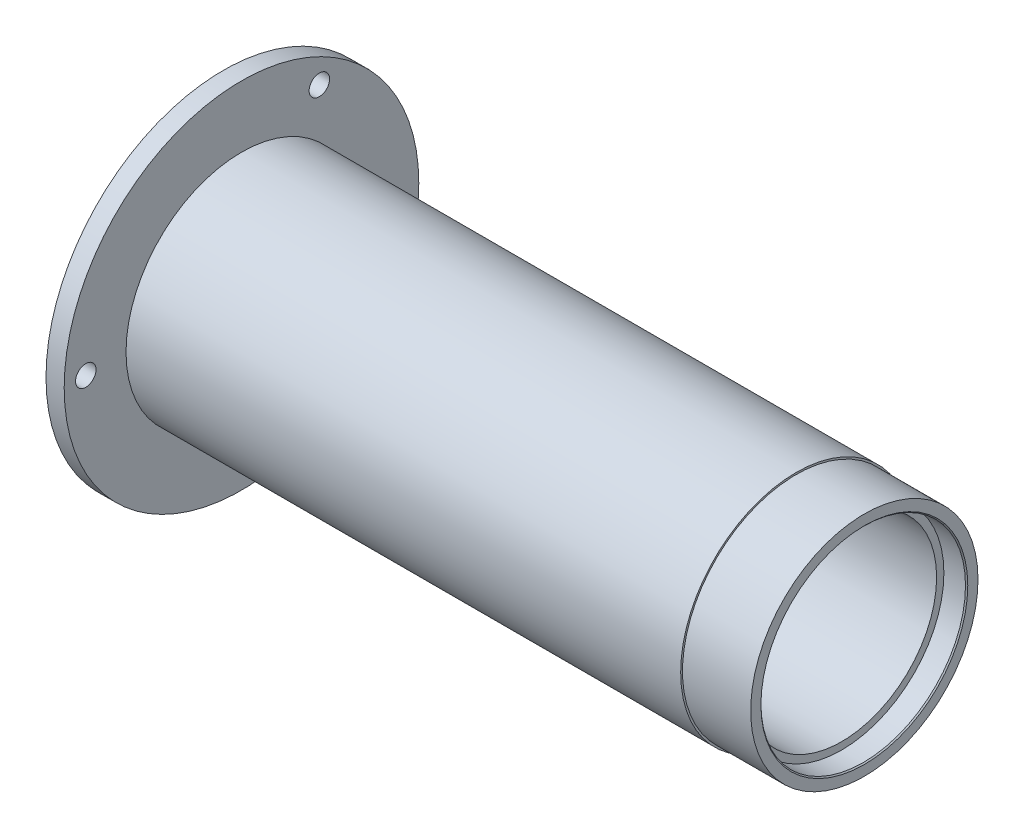
ISO-10303-21;
HEADER;
FILE_DESCRIPTION(('STEP AP214'),'2;1');
FILE_NAME('part.step','',(''),(''),'','','');
FILE_SCHEMA(('AUTOMOTIVE_DESIGN { 1 0 10303 214 1 1 1 1 }'));
ENDSEC;
DATA;
#1=APPLICATION_CONTEXT('core data for automotive mechanical design processes');
#2=APPLICATION_PROTOCOL_DEFINITION('international standard','automotive_design',2000,#1);
#3=PRODUCT_CONTEXT('',#1,'mechanical');
#4=PRODUCT('Part','Part','',(#3));
#5=PRODUCT_RELATED_PRODUCT_CATEGORY('part','',(#4));
#6=PRODUCT_DEFINITION_FORMATION('','',#4);
#7=PRODUCT_DEFINITION_CONTEXT('part definition',#1,'design');
#8=PRODUCT_DEFINITION('design','',#6,#7);
#9=PRODUCT_DEFINITION_SHAPE('','',#8);
#10=(LENGTH_UNIT() NAMED_UNIT(*) SI_UNIT(.MILLI.,.METRE.));
#11=(NAMED_UNIT(*) PLANE_ANGLE_UNIT() SI_UNIT($,.RADIAN.));
#12=(NAMED_UNIT(*) SI_UNIT($,.STERADIAN.) SOLID_ANGLE_UNIT());
#13=UNCERTAINTY_MEASURE_WITH_UNIT(LENGTH_MEASURE(1.E-05),#10,'distance_accuracy_value','');
#14=(GEOMETRIC_REPRESENTATION_CONTEXT(3) GLOBAL_UNCERTAINTY_ASSIGNED_CONTEXT((#13)) GLOBAL_UNIT_ASSIGNED_CONTEXT((#10,
#11,#12)) REPRESENTATION_CONTEXT('',''));
#15=CARTESIAN_POINT('',(0.,0.,0.));
#16=DIRECTION('',(0.,0.,1.));
#17=DIRECTION('',(1.,0.,0.));
#18=AXIS2_PLACEMENT_3D('',#15,#16,#17);
#19=CARTESIAN_POINT('',(-1.2E-05,0.,0.));
#20=DIRECTION('',(1.,0.,0.));
#21=DIRECTION('',(0.,0.,-1.));
#22=AXIS2_PLACEMENT_3D('',#19,#20,#21);
#23=CYLINDRICAL_SURFACE('',#22,41.8);
#24=CARTESIAN_POINT('',(10.,0.,0.));
#25=DIRECTION('',(1.,0.,0.));
#26=DIRECTION('',(0.,0.,-1.));
#27=AXIS2_PLACEMENT_3D('',#24,#25,#26);
#28=CIRCLE('',#27,41.8);
#29=CARTESIAN_POINT('',(10.,0.,-41.8));
#30=VERTEX_POINT('',#29);
#31=EDGE_CURVE('E76',#30,#30,#28,.F.);
#32=CARTESIAN_POINT('',(272.,0.,0.));
#33=DIRECTION('',(1.,0.,0.));
#34=DIRECTION('',(0.,0.,-1.));
#35=AXIS2_PLACEMENT_3D('',#32,#33,#34);
#36=CIRCLE('',#35,41.8);
#37=CARTESIAN_POINT('',(272.,0.,-41.8));
#38=VERTEX_POINT('',#37);
#39=EDGE_CURVE('E71',#38,#38,#36,.F.);
#40=CARTESIAN_POINT('',(10.,0.,-41.8));
#41=CARTESIAN_POINT('',(12.7291666666667,0.,-41.8));
#42=CARTESIAN_POINT('',(15.4583333333333,0.,-41.8));
#43=CARTESIAN_POINT('',(20.9166666666667,0.,-41.8));
#44=CARTESIAN_POINT('',(23.6458333333333,0.,-41.8));
#45=CARTESIAN_POINT('',(29.1041666666667,0.,-41.8));
#46=CARTESIAN_POINT('',(31.8333333333333,0.,-41.8));
#47=CARTESIAN_POINT('',(37.2916666666667,0.,-41.8));
#48=CARTESIAN_POINT('',(40.0208333333333,0.,-41.8));
#49=CARTESIAN_POINT('',(45.4791666666667,0.,-41.8));
#50=CARTESIAN_POINT('',(48.2083333333333,0.,-41.8));
#51=CARTESIAN_POINT('',(53.6666666666667,0.,-41.8));
#52=CARTESIAN_POINT('',(56.3958333333333,0.,-41.8));
#53=CARTESIAN_POINT('',(61.8541666666667,0.,-41.8));
#54=CARTESIAN_POINT('',(64.5833333333333,0.,-41.8));
#55=CARTESIAN_POINT('',(70.0416666666667,0.,-41.8));
#56=CARTESIAN_POINT('',(72.7708333333333,0.,-41.8));
#57=CARTESIAN_POINT('',(78.2291666666667,0.,-41.8));
#58=CARTESIAN_POINT('',(80.9583333333333,0.,-41.8));
#59=CARTESIAN_POINT('',(86.4166666666667,0.,-41.8));
#60=CARTESIAN_POINT('',(89.1458333333333,0.,-41.8));
#61=CARTESIAN_POINT('',(94.6041666666667,0.,-41.8));
#62=CARTESIAN_POINT('',(97.3333333333333,0.,-41.8));
#63=CARTESIAN_POINT('',(102.791666666667,0.,-41.8));
#64=CARTESIAN_POINT('',(105.520833333333,0.,-41.8));
#65=CARTESIAN_POINT('',(110.979166666667,0.,-41.8));
#66=CARTESIAN_POINT('',(113.708333333333,0.,-41.8));
#67=CARTESIAN_POINT('',(119.166666666667,0.,-41.8));
#68=CARTESIAN_POINT('',(121.895833333333,0.,-41.8));
#69=CARTESIAN_POINT('',(127.354166666667,0.,-41.8));
#70=CARTESIAN_POINT('',(130.083333333333,0.,-41.8));
#71=CARTESIAN_POINT('',(135.541666666667,0.,-41.8));
#72=CARTESIAN_POINT('',(138.270833333333,0.,-41.8));
#73=CARTESIAN_POINT('',(143.729166666667,0.,-41.8));
#74=CARTESIAN_POINT('',(146.458333333333,0.,-41.8));
#75=CARTESIAN_POINT('',(151.916666666667,0.,-41.8));
#76=CARTESIAN_POINT('',(154.645833333333,0.,-41.8));
#77=CARTESIAN_POINT('',(160.104166666667,0.,-41.8));
#78=CARTESIAN_POINT('',(162.833333333333,0.,-41.8));
#79=CARTESIAN_POINT('',(168.291666666667,0.,-41.8));
#80=CARTESIAN_POINT('',(171.020833333333,0.,-41.8));
#81=CARTESIAN_POINT('',(176.479166666667,0.,-41.8));
#82=CARTESIAN_POINT('',(179.208333333333,0.,-41.8));
#83=CARTESIAN_POINT('',(184.666666666667,0.,-41.8));
#84=CARTESIAN_POINT('',(187.395833333333,0.,-41.8));
#85=CARTESIAN_POINT('',(192.854166666667,0.,-41.8));
#86=CARTESIAN_POINT('',(195.583333333333,0.,-41.8));
#87=CARTESIAN_POINT('',(201.041666666667,0.,-41.8));
#88=CARTESIAN_POINT('',(203.770833333333,0.,-41.8));
#89=CARTESIAN_POINT('',(209.229166666667,0.,-41.8));
#90=CARTESIAN_POINT('',(211.958333333333,0.,-41.8));
#91=CARTESIAN_POINT('',(217.416666666667,0.,-41.8));
#92=CARTESIAN_POINT('',(220.145833333333,0.,-41.8));
#93=CARTESIAN_POINT('',(225.604166666667,0.,-41.8));
#94=CARTESIAN_POINT('',(228.333333333333,0.,-41.8));
#95=CARTESIAN_POINT('',(233.791666666667,0.,-41.8));
#96=CARTESIAN_POINT('',(236.520833333333,0.,-41.8));
#97=CARTESIAN_POINT('',(241.979166666667,0.,-41.8));
#98=CARTESIAN_POINT('',(244.708333333333,0.,-41.8));
#99=CARTESIAN_POINT('',(250.166666666667,0.,-41.8));
#100=CARTESIAN_POINT('',(252.895833333333,0.,-41.8));
#101=CARTESIAN_POINT('',(258.354166666667,0.,-41.8));
#102=CARTESIAN_POINT('',(261.083333333333,0.,-41.8));
#103=CARTESIAN_POINT('',(266.541666666667,0.,-41.8));
#104=CARTESIAN_POINT('',(269.270833333333,0.,-41.8));
#105=CARTESIAN_POINT('',(272.,0.,-41.8));
#106=B_SPLINE_CURVE_WITH_KNOTS('',3,(#40,#41,#42,#43,#44,#45,#46,#47,#48,#49,#50,#51,#52,#53,
#54,#55,#56,#57,#58,#59,#60,#61,#62,#63,#64,#65,#66,#67,#68,#69,#70,#71,#72,#73,#74,#75,#76,#77,
#78,#79,#80,#81,#82,#83,#84,#85,#86,#87,#88,#89,#90,#91,#92,#93,#94,#95,#96,#97,#98,#99,#100,
#101,#102,#103,#104,#105),.UNSPECIFIED.,.F.,.F.,(4,2,2,2,2,2,2,2,2,2,2,2,2,2,2,2,2,2,2,2,2,2,2,
2,2,2,2,2,2,2,2,2,4),(0.,8.1875,16.375,24.5625,32.75,40.9375,49.125,57.3125,65.5,73.6875,81.875,
90.0625,98.25,106.4375,114.625,122.8125,131.,139.1875,147.375,155.5625,163.75,171.9375,180.125,
188.3125,196.5,204.6875,212.875,221.0625,229.25,237.4375,245.625,253.8125,262.),.UNSPECIFIED.);
#107=EDGE_CURVE('BSEAM37',#30,#38,#106,.T.);
#108=ORIENTED_EDGE('',*,*,#31,.T.);
#109=ORIENTED_EDGE('',*,*,#39,.F.);
#110=ORIENTED_EDGE('',*,*,#107,.T.);
#111=ORIENTED_EDGE('',*,*,#107,.F.);
#112=EDGE_LOOP('',(#108,#110,#109,#111));
#113=FACE_BOUND('',#112,.T.);
#114=ADVANCED_FACE('F37',(#113),#23,.F.);
#115=CARTESIAN_POINT('',(8.,0.,0.));
#116=DIRECTION('',(-1.,0.,0.));
#117=DIRECTION('',(0.,0.,1.));
#118=AXIS2_PLACEMENT_3D('',#115,#116,#117);
#119=CYLINDRICAL_SURFACE('',#118,78.);
#120=CARTESIAN_POINT('',(8.,0.,0.));
#121=DIRECTION('',(1.,0.,0.));
#122=DIRECTION('',(0.,0.,-1.));
#123=AXIS2_PLACEMENT_3D('',#120,#121,#122);
#124=CIRCLE('',#123,78.);
#125=CARTESIAN_POINT('',(8.,0.,-78.));
#126=VERTEX_POINT('',#125);
#127=EDGE_CURVE('E58',#126,#126,#124,.T.);
#128=ORIENTED_EDGE('',*,*,#127,.F.);
#129=EDGE_LOOP('',(#128));
#130=FACE_BOUND('',#129,.T.);
#131=CARTESIAN_POINT('',(0.,0.,0.));
#132=DIRECTION('',(1.,0.,0.));
#133=DIRECTION('',(0.,0.,-1.));
#134=AXIS2_PLACEMENT_3D('',#131,#132,#133);
#135=CIRCLE('',#134,78.);
#136=CARTESIAN_POINT('',(0.,0.,-78.));
#137=VERTEX_POINT('',#136);
#138=EDGE_CURVE('E84',#137,#137,#135,.T.);
#139=ORIENTED_EDGE('',*,*,#138,.T.);
#140=EDGE_LOOP('',(#139));
#141=FACE_BOUND('',#140,.T.);
#142=ADVANCED_FACE('F114',(#130,#141),#119,.T.);
#143=CARTESIAN_POINT('',(8.,0.,0.));
#144=DIRECTION('',(1.,0.,0.));
#145=DIRECTION('',(0.,0.,-1.));
#146=AXIS2_PLACEMENT_3D('',#143,#144,#145);
#147=PLANE('',#146);
#148=CARTESIAN_POINT('',(8.,0.,68.5));
#149=DIRECTION('',(1.,0.,0.));
#150=DIRECTION('',(0.,0.,-1.));
#151=AXIS2_PLACEMENT_3D('',#148,#149,#150);
#152=CIRCLE('',#151,4.5);
#153=CARTESIAN_POINT('',(8.,0.,64.));
#154=VERTEX_POINT('',#153);
#155=EDGE_CURVE('E62',#154,#154,#152,.T.);
#156=ORIENTED_EDGE('',*,*,#155,.F.);
#157=EDGE_LOOP('',(#156));
#158=FACE_BOUND('',#157,.T.);
#159=CARTESIAN_POINT('',(8.,59.3227401592341,-34.25));
#160=DIRECTION('',(1.,0.,0.));
#161=DIRECTION('',(0.,0.,-1.));
#162=AXIS2_PLACEMENT_3D('',#159,#160,#161);
#163=CIRCLE('',#162,4.5);
#164=CARTESIAN_POINT('',(8.,59.3227401592341,-38.75));
#165=VERTEX_POINT('',#164);
#166=EDGE_CURVE('E63',#165,#165,#163,.T.);
#167=ORIENTED_EDGE('',*,*,#166,.F.);
#168=EDGE_LOOP('',(#167));
#169=FACE_BOUND('',#168,.T.);
#170=CARTESIAN_POINT('',(8.,-59.3227401592341,-34.25));
#171=DIRECTION('',(1.,0.,0.));
#172=DIRECTION('',(0.,0.,-1.));
#173=AXIS2_PLACEMENT_3D('',#170,#171,#172);
#174=CIRCLE('',#173,4.5);
#175=CARTESIAN_POINT('',(8.,-59.3227401592341,-38.75));
#176=VERTEX_POINT('',#175);
#177=EDGE_CURVE('E67',#176,#176,#174,.T.);
#178=ORIENTED_EDGE('',*,*,#177,.F.);
#179=EDGE_LOOP('',(#178));
#180=FACE_BOUND('',#179,.T.);
#181=CARTESIAN_POINT('',(8.00000000000001,0.,0.));
#182=DIRECTION('',(1.,0.,0.));
#183=DIRECTION('',(0.,0.,-1.));
#184=AXIS2_PLACEMENT_3D('',#181,#182,#183);
#185=CIRCLE('',#184,50.8);
#186=CARTESIAN_POINT('',(8.00000000000001,0.,-50.8));
#187=VERTEX_POINT('',#186);
#188=EDGE_CURVE('E87',#187,#187,#185,.F.);
#189=ORIENTED_EDGE('',*,*,#188,.T.);
#190=EDGE_LOOP('',(#189));
#191=FACE_BOUND('',#190,.T.);
#192=ORIENTED_EDGE('',*,*,#127,.T.);
#193=EDGE_LOOP('',(#192));
#194=FACE_BOUND('',#193,.T.);
#195=ADVANCED_FACE('F110',(#158,#169,#180,#191,#194),#147,.T.);
#196=CARTESIAN_POINT('',(0.,0.,0.));
#197=DIRECTION('',(1.,0.,0.));
#198=DIRECTION('',(0.,0.,-1.));
#199=AXIS2_PLACEMENT_3D('',#196,#197,#198);
#200=PLANE('',#199);
#201=CARTESIAN_POINT('',(0.,0.,0.));
#202=DIRECTION('',(1.,0.,0.));
#203=DIRECTION('',(0.,0.,-1.));
#204=AXIS2_PLACEMENT_3D('',#201,#202,#203);
#205=CIRCLE('',#204,45.4999999999999);
#206=CARTESIAN_POINT('',(0.,0.,-45.4999999999999));
#207=VERTEX_POINT('',#206);
#208=EDGE_CURVE('E53',#207,#207,#205,.T.);
#209=ORIENTED_EDGE('',*,*,#208,.T.);
#210=EDGE_LOOP('',(#209));
#211=FACE_BOUND('',#210,.T.);
#212=CARTESIAN_POINT('',(0.,0.,68.5));
#213=DIRECTION('',(1.,0.,0.));
#214=DIRECTION('',(0.,0.,-1.));
#215=AXIS2_PLACEMENT_3D('',#212,#213,#214);
#216=CIRCLE('',#215,4.5);
#217=CARTESIAN_POINT('',(0.,0.,64.));
#218=VERTEX_POINT('',#217);
#219=EDGE_CURVE('E59',#218,#218,#216,.T.);
#220=ORIENTED_EDGE('',*,*,#219,.T.);
#221=EDGE_LOOP('',(#220));
#222=FACE_BOUND('',#221,.T.);
#223=CARTESIAN_POINT('',(0.,59.3227401592341,-34.25));
#224=DIRECTION('',(1.,0.,0.));
#225=DIRECTION('',(0.,0.,-1.));
#226=AXIS2_PLACEMENT_3D('',#223,#224,#225);
#227=CIRCLE('',#226,4.5);
#228=CARTESIAN_POINT('',(0.,59.3227401592341,-38.75));
#229=VERTEX_POINT('',#228);
#230=EDGE_CURVE('E64',#229,#229,#227,.T.);
#231=ORIENTED_EDGE('',*,*,#230,.T.);
#232=EDGE_LOOP('',(#231));
#233=FACE_BOUND('',#232,.T.);
#234=CARTESIAN_POINT('',(0.,-59.3227401592341,-34.25));
#235=DIRECTION('',(1.,0.,0.));
#236=DIRECTION('',(0.,0.,-1.));
#237=AXIS2_PLACEMENT_3D('',#234,#235,#236);
#238=CIRCLE('',#237,4.5);
#239=CARTESIAN_POINT('',(0.,-59.3227401592341,-38.75));
#240=VERTEX_POINT('',#239);
#241=EDGE_CURVE('E68',#240,#240,#238,.T.);
#242=ORIENTED_EDGE('',*,*,#241,.T.);
#243=EDGE_LOOP('',(#242));
#244=FACE_BOUND('',#243,.T.);
#245=ORIENTED_EDGE('',*,*,#138,.F.);
#246=EDGE_LOOP('',(#245));
#247=FACE_BOUND('',#246,.T.);
#248=ADVANCED_FACE('F113',(#211,#222,#233,#244,#247),#200,.F.);
#249=CARTESIAN_POINT('',(252.,0.,0.));
#250=DIRECTION('',(-1.,0.,0.));
#251=DIRECTION('',(0.,0.,1.));
#252=AXIS2_PLACEMENT_3D('',#249,#250,#251);
#253=CYLINDRICAL_SURFACE('',#252,50.8);
#254=ORIENTED_EDGE('',*,*,#188,.F.);
#255=EDGE_LOOP('',(#254));
#256=FACE_BOUND('',#255,.T.);
#257=CARTESIAN_POINT('',(252.,0.,0.));
#258=DIRECTION('',(1.,0.,0.));
#259=DIRECTION('',(0.,0.,-1.));
#260=AXIS2_PLACEMENT_3D('',#257,#258,#259);
#261=CIRCLE('',#260,50.8);
#262=CARTESIAN_POINT('',(252.,0.,-50.8));
#263=VERTEX_POINT('',#262);
#264=EDGE_CURVE('E83',#263,#263,#261,.T.);
#265=ORIENTED_EDGE('',*,*,#264,.F.);
#266=EDGE_LOOP('',(#265));
#267=FACE_BOUND('',#266,.T.);
#268=ADVANCED_FACE('F127',(#256,#267),#253,.T.);
#269=CARTESIAN_POINT('',(252.,0.,0.));
#270=DIRECTION('',(1.,0.,0.));
#271=DIRECTION('',(0.,0.,-1.));
#272=AXIS2_PLACEMENT_3D('',#269,#270,#271);
#273=PLANE('',#272);
#274=CARTESIAN_POINT('',(252.,0.,0.));
#275=DIRECTION('',(1.,0.,0.));
#276=DIRECTION('',(0.,0.,-1.));
#277=AXIS2_PLACEMENT_3D('',#274,#275,#276);
#278=CIRCLE('',#277,50.);
#279=CARTESIAN_POINT('',(252.,0.,-50.));
#280=VERTEX_POINT('',#279);
#281=EDGE_CURVE('E80',#280,#280,#278,.F.);
#282=ORIENTED_EDGE('',*,*,#281,.T.);
#283=EDGE_LOOP('',(#282));
#284=FACE_BOUND('',#283,.T.);
#285=ORIENTED_EDGE('',*,*,#264,.T.);
#286=EDGE_LOOP('',(#285));
#287=FACE_BOUND('',#286,.T.);
#288=ADVANCED_FACE('F133',(#284,#287),#273,.T.);
#289=CARTESIAN_POINT('',(282.,0.,0.));
#290=DIRECTION('',(-1.,0.,0.));
#291=DIRECTION('',(0.,0.,1.));
#292=AXIS2_PLACEMENT_3D('',#289,#290,#291);
#293=CYLINDRICAL_SURFACE('',#292,50.);
#294=ORIENTED_EDGE('',*,*,#281,.F.);
#295=EDGE_LOOP('',(#294));
#296=FACE_BOUND('',#295,.T.);
#297=CARTESIAN_POINT('',(282.,0.,0.));
#298=DIRECTION('',(1.,0.,0.));
#299=DIRECTION('',(0.,0.,-1.));
#300=AXIS2_PLACEMENT_3D('',#297,#298,#299);
#301=CIRCLE('',#300,50.);
#302=CARTESIAN_POINT('',(282.,0.,-50.));
#303=VERTEX_POINT('',#302);
#304=EDGE_CURVE('E79',#303,#303,#301,.T.);
#305=ORIENTED_EDGE('',*,*,#304,.F.);
#306=EDGE_LOOP('',(#305));
#307=FACE_BOUND('',#306,.T.);
#308=ADVANCED_FACE('F151',(#296,#307),#293,.T.);
#309=CARTESIAN_POINT('',(282.,0.,0.));
#310=DIRECTION('',(1.,0.,0.));
#311=DIRECTION('',(0.,0.,-1.));
#312=AXIS2_PLACEMENT_3D('',#309,#310,#311);
#313=PLANE('',#312);
#314=CARTESIAN_POINT('',(282.,0.,0.));
#315=DIRECTION('',(1.,0.,0.));
#316=DIRECTION('',(0.,0.,-1.));
#317=AXIS2_PLACEMENT_3D('',#314,#315,#316);
#318=CIRCLE('',#317,45.4999999999999);
#319=CARTESIAN_POINT('',(282.,0.,-45.4999999999999));
#320=VERTEX_POINT('',#319);
#321=EDGE_CURVE('E10',#320,#320,#318,.F.);
#322=ORIENTED_EDGE('',*,*,#321,.T.);
#323=EDGE_LOOP('',(#322));
#324=FACE_BOUND('',#323,.T.);
#325=ORIENTED_EDGE('',*,*,#304,.T.);
#326=EDGE_LOOP('',(#325));
#327=FACE_BOUND('',#326,.T.);
#328=ADVANCED_FACE('F147',(#324,#327),#313,.T.);
#329=CARTESIAN_POINT('',(10.,0.,0.));
#330=DIRECTION('',(1.,0.,0.));
#331=DIRECTION('',(0.,0.,-1.));
#332=AXIS2_PLACEMENT_3D('',#329,#330,#331);
#333=PLANE('',#332);
#334=CARTESIAN_POINT('',(10.,0.,0.));
#335=DIRECTION('',(1.,0.,0.));
#336=DIRECTION('',(0.,0.,-1.));
#337=AXIS2_PLACEMENT_3D('',#334,#335,#336);
#338=CIRCLE('',#337,45.);
#339=CARTESIAN_POINT('',(10.,0.,-45.));
#340=VERTEX_POINT('',#339);
#341=EDGE_CURVE('E74',#340,#340,#338,.T.);
#342=ORIENTED_EDGE('',*,*,#341,.F.);
#343=EDGE_LOOP('',(#342));
#344=FACE_BOUND('',#343,.T.);
#345=ORIENTED_EDGE('',*,*,#31,.F.);
#346=EDGE_LOOP('',(#345));
#347=FACE_BOUND('',#346,.T.);
#348=ADVANCED_FACE('F150',(#344,#347),#333,.F.);
#349=CARTESIAN_POINT('',(10.,0.,0.));
#350=DIRECTION('',(-1.,0.,0.));
#351=DIRECTION('',(0.,0.,1.));
#352=AXIS2_PLACEMENT_3D('',#349,#350,#351);
#353=CYLINDRICAL_SURFACE('',#352,45.);
#354=CARTESIAN_POINT('',(0.499999999999931,0.,0.));
#355=DIRECTION('',(1.,0.,0.));
#356=DIRECTION('',(0.,0.,-1.));
#357=AXIS2_PLACEMENT_3D('',#354,#355,#356);
#358=CIRCLE('',#357,45.);
#359=CARTESIAN_POINT('',(0.499999999999931,0.,-45.));
#360=VERTEX_POINT('',#359);
#361=EDGE_CURVE('E49',#360,#360,#358,.F.);
#362=ORIENTED_EDGE('',*,*,#361,.T.);
#363=EDGE_LOOP('',(#362));
#364=FACE_BOUND('',#363,.T.);
#365=ORIENTED_EDGE('',*,*,#341,.T.);
#366=EDGE_LOOP('',(#365));
#367=FACE_BOUND('',#366,.T.);
#368=ADVANCED_FACE('F145',(#364,#367),#353,.F.);
#369=CARTESIAN_POINT('',(272.,0.,0.));
#370=DIRECTION('',(1.,0.,0.));
#371=DIRECTION('',(0.,0.,-1.));
#372=AXIS2_PLACEMENT_3D('',#369,#370,#371);
#373=PLANE('',#372);
#374=CARTESIAN_POINT('',(272.,0.,0.));
#375=DIRECTION('',(1.,0.,0.));
#376=DIRECTION('',(0.,0.,-1.));
#377=AXIS2_PLACEMENT_3D('',#374,#375,#376);
#378=CIRCLE('',#377,45.);
#379=CARTESIAN_POINT('',(272.,0.,-45.));
#380=VERTEX_POINT('',#379);
#381=EDGE_CURVE('E75',#380,#380,#378,.T.);
#382=ORIENTED_EDGE('',*,*,#381,.T.);
#383=EDGE_LOOP('',(#382));
#384=FACE_BOUND('',#383,.T.);
#385=ORIENTED_EDGE('',*,*,#39,.T.);
#386=EDGE_LOOP('',(#385));
#387=FACE_BOUND('',#386,.T.);
#388=ADVANCED_FACE('F190',(#384,#387),#373,.T.);
#389=CARTESIAN_POINT('',(272.,0.,0.));
#390=DIRECTION('',(1.,0.,0.));
#391=DIRECTION('',(0.,0.,-1.));
#392=AXIS2_PLACEMENT_3D('',#389,#390,#391);
#393=CYLINDRICAL_SURFACE('',#392,45.);
#394=CARTESIAN_POINT('',(281.5,0.,0.));
#395=DIRECTION('',(1.,0.,0.));
#396=DIRECTION('',(0.,0.,-1.));
#397=AXIS2_PLACEMENT_3D('',#394,#395,#396);
#398=CIRCLE('',#397,45.);
#399=CARTESIAN_POINT('',(281.5,0.,-45.));
#400=VERTEX_POINT('',#399);
#401=EDGE_CURVE('E45',#400,#400,#398,.T.);
#402=ORIENTED_EDGE('',*,*,#401,.T.);
#403=EDGE_LOOP('',(#402));
#404=FACE_BOUND('',#403,.T.);
#405=ORIENTED_EDGE('',*,*,#381,.F.);
#406=EDGE_LOOP('',(#405));
#407=FACE_BOUND('',#406,.T.);
#408=ADVANCED_FACE('F197',(#404,#407),#393,.F.);
#409=CARTESIAN_POINT('',(-1.2E-05,-59.3227401592341,-34.25));
#410=DIRECTION('',(1.,0.,0.));
#411=DIRECTION('',(0.,0.,-1.));
#412=AXIS2_PLACEMENT_3D('',#409,#410,#411);
#413=CYLINDRICAL_SURFACE('',#412,4.5);
#414=CARTESIAN_POINT('',(8.,-59.3227401592341,-38.75));
#415=CARTESIAN_POINT('',(7.91666666666667,-59.3227401592341,-38.75));
#416=CARTESIAN_POINT('',(7.83333333333333,-59.3227401592341,-38.75));
#417=CARTESIAN_POINT('',(7.66666666666667,-59.3227401592341,-38.75));
#418=CARTESIAN_POINT('',(7.58333333333333,-59.3227401592341,-38.75));
#419=CARTESIAN_POINT('',(7.41666666666667,-59.3227401592341,-38.75));
#420=CARTESIAN_POINT('',(7.33333333333333,-59.3227401592341,-38.75));
#421=CARTESIAN_POINT('',(7.16666666666667,-59.3227401592341,-38.75));
#422=CARTESIAN_POINT('',(7.08333333333333,-59.3227401592341,-38.75));
#423=CARTESIAN_POINT('',(6.91666666666667,-59.3227401592341,-38.75));
#424=CARTESIAN_POINT('',(6.83333333333333,-59.3227401592341,-38.75));
#425=CARTESIAN_POINT('',(6.66666666666667,-59.3227401592341,-38.75));
#426=CARTESIAN_POINT('',(6.58333333333333,-59.3227401592341,-38.75));
#427=CARTESIAN_POINT('',(6.41666666666667,-59.3227401592341,-38.75));
#428=CARTESIAN_POINT('',(6.33333333333333,-59.3227401592341,-38.75));
#429=CARTESIAN_POINT('',(6.16666666666667,-59.3227401592341,-38.75));
#430=CARTESIAN_POINT('',(6.08333333333333,-59.3227401592341,-38.75));
#431=CARTESIAN_POINT('',(5.91666666666667,-59.3227401592341,-38.75));
#432=CARTESIAN_POINT('',(5.83333333333333,-59.3227401592341,-38.75));
#433=CARTESIAN_POINT('',(5.66666666666667,-59.3227401592341,-38.75));
#434=CARTESIAN_POINT('',(5.58333333333333,-59.3227401592341,-38.75));
#435=CARTESIAN_POINT('',(5.41666666666667,-59.3227401592341,-38.75));
#436=CARTESIAN_POINT('',(5.33333333333333,-59.3227401592341,-38.75));
#437=CARTESIAN_POINT('',(5.16666666666667,-59.3227401592341,-38.75));
#438=CARTESIAN_POINT('',(5.08333333333333,-59.3227401592341,-38.75));
#439=CARTESIAN_POINT('',(4.91666666666667,-59.3227401592341,-38.75));
#440=CARTESIAN_POINT('',(4.83333333333333,-59.3227401592341,-38.75));
#441=CARTESIAN_POINT('',(4.66666666666667,-59.3227401592341,-38.75));
#442=CARTESIAN_POINT('',(4.58333333333333,-59.3227401592341,-38.75));
#443=CARTESIAN_POINT('',(4.41666666666667,-59.3227401592341,-38.75));
#444=CARTESIAN_POINT('',(4.33333333333333,-59.3227401592341,-38.75));
#445=CARTESIAN_POINT('',(4.16666666666667,-59.3227401592341,-38.75));
#446=CARTESIAN_POINT('',(4.08333333333333,-59.3227401592341,-38.75));
#447=CARTESIAN_POINT('',(3.91666666666667,-59.3227401592341,-38.75));
#448=CARTESIAN_POINT('',(3.83333333333333,-59.3227401592341,-38.75));
#449=CARTESIAN_POINT('',(3.66666666666667,-59.3227401592341,-38.75));
#450=CARTESIAN_POINT('',(3.58333333333333,-59.3227401592341,-38.75));
#451=CARTESIAN_POINT('',(3.41666666666667,-59.3227401592341,-38.75));
#452=CARTESIAN_POINT('',(3.33333333333333,-59.3227401592341,-38.75));
#453=CARTESIAN_POINT('',(3.16666666666667,-59.3227401592341,-38.75));
#454=CARTESIAN_POINT('',(3.08333333333333,-59.3227401592341,-38.75));
#455=CARTESIAN_POINT('',(2.91666666666667,-59.3227401592341,-38.75));
#456=CARTESIAN_POINT('',(2.83333333333333,-59.3227401592341,-38.75));
#457=CARTESIAN_POINT('',(2.66666666666667,-59.3227401592341,-38.75));
#458=CARTESIAN_POINT('',(2.58333333333333,-59.3227401592341,-38.75));
#459=CARTESIAN_POINT('',(2.41666666666667,-59.3227401592341,-38.75));
#460=CARTESIAN_POINT('',(2.33333333333333,-59.3227401592341,-38.75));
#461=CARTESIAN_POINT('',(2.16666666666667,-59.3227401592341,-38.75));
#462=CARTESIAN_POINT('',(2.08333333333333,-59.3227401592341,-38.75));
#463=CARTESIAN_POINT('',(1.91666666666667,-59.3227401592341,-38.75));
#464=CARTESIAN_POINT('',(1.83333333333333,-59.3227401592341,-38.75));
#465=CARTESIAN_POINT('',(1.66666666666667,-59.3227401592341,-38.75));
#466=CARTESIAN_POINT('',(1.58333333333333,-59.3227401592341,-38.75));
#467=CARTESIAN_POINT('',(1.41666666666667,-59.3227401592341,-38.75));
#468=CARTESIAN_POINT('',(1.33333333333333,-59.3227401592341,-38.75));
#469=CARTESIAN_POINT('',(1.16666666666667,-59.3227401592341,-38.75));
#470=CARTESIAN_POINT('',(1.08333333333333,-59.3227401592341,-38.75));
#471=CARTESIAN_POINT('',(0.916666666666667,-59.3227401592341,-38.75));
#472=CARTESIAN_POINT('',(0.833333333333334,-59.3227401592341,-38.75));
#473=CARTESIAN_POINT('',(0.666666666666667,-59.3227401592341,-38.75));
#474=CARTESIAN_POINT('',(0.583333333333334,-59.3227401592341,-38.75));
#475=CARTESIAN_POINT('',(0.416666666666668,-59.3227401592341,-38.75));
#476=CARTESIAN_POINT('',(0.333333333333334,-59.3227401592341,-38.75));
#477=CARTESIAN_POINT('',(0.166666666666667,-59.3227401592341,-38.75));
#478=CARTESIAN_POINT('',(0.0833333333333339,-59.3227401592341,-38.75));
#479=CARTESIAN_POINT('',(0.,-59.3227401592341,-38.75));
#480=B_SPLINE_CURVE_WITH_KNOTS('',3,(#414,#415,#416,#417,#418,#419,#420,#421,#422,#423,#424,
#425,#426,#427,#428,#429,#430,#431,#432,#433,#434,#435,#436,#437,#438,#439,#440,#441,#442,#443,
#444,#445,#446,#447,#448,#449,#450,#451,#452,#453,#454,#455,#456,#457,#458,#459,#460,#461,#462,
#463,#464,#465,#466,#467,#468,#469,#470,#471,#472,#473,#474,#475,#476,#477,#478,#479),
.UNSPECIFIED.,.F.,.F.,(4,2,2,2,2,2,2,2,2,2,2,2,2,2,2,2,2,2,2,2,2,2,2,2,2,2,2,2,2,2,2,2,4),(0.,
0.249999999999999,0.499999999999999,0.749999999999998,0.999999999999998,1.25,1.5,1.75,2.,2.25,
2.5,2.75,3.,3.25,3.5,3.75,4.,4.25,4.5,4.75,5.,5.25,5.5,5.75,6.,6.25,6.5,6.75,7.,7.25,7.5,7.75,
8.),.UNSPECIFIED.);
#481=EDGE_CURVE('BSEAM107',#176,#240,#480,.T.);
#482=ORIENTED_EDGE('',*,*,#177,.T.);
#483=ORIENTED_EDGE('',*,*,#241,.F.);
#484=ORIENTED_EDGE('',*,*,#481,.T.);
#485=ORIENTED_EDGE('',*,*,#481,.F.);
#486=EDGE_LOOP('',(#482,#484,#483,#485));
#487=FACE_BOUND('',#486,.T.);
#488=ADVANCED_FACE('F107',(#487),#413,.F.);
#489=CARTESIAN_POINT('',(-1.2E-05,59.3227401592341,-34.25));
#490=DIRECTION('',(1.,0.,0.));
#491=DIRECTION('',(0.,0.,-1.));
#492=AXIS2_PLACEMENT_3D('',#489,#490,#491);
#493=CYLINDRICAL_SURFACE('',#492,4.5);
#494=CARTESIAN_POINT('',(8.,59.3227401592341,-38.75));
#495=CARTESIAN_POINT('',(7.91666666666667,59.3227401592341,-38.75));
#496=CARTESIAN_POINT('',(7.83333333333333,59.3227401592341,-38.75));
#497=CARTESIAN_POINT('',(7.66666666666667,59.3227401592341,-38.75));
#498=CARTESIAN_POINT('',(7.58333333333333,59.3227401592341,-38.75));
#499=CARTESIAN_POINT('',(7.41666666666667,59.3227401592341,-38.75));
#500=CARTESIAN_POINT('',(7.33333333333333,59.3227401592341,-38.75));
#501=CARTESIAN_POINT('',(7.16666666666667,59.3227401592341,-38.75));
#502=CARTESIAN_POINT('',(7.08333333333333,59.3227401592341,-38.75));
#503=CARTESIAN_POINT('',(6.91666666666667,59.3227401592341,-38.75));
#504=CARTESIAN_POINT('',(6.83333333333333,59.3227401592341,-38.75));
#505=CARTESIAN_POINT('',(6.66666666666667,59.3227401592341,-38.75));
#506=CARTESIAN_POINT('',(6.58333333333333,59.3227401592341,-38.75));
#507=CARTESIAN_POINT('',(6.41666666666667,59.3227401592341,-38.75));
#508=CARTESIAN_POINT('',(6.33333333333333,59.3227401592341,-38.75));
#509=CARTESIAN_POINT('',(6.16666666666667,59.3227401592341,-38.75));
#510=CARTESIAN_POINT('',(6.08333333333333,59.3227401592341,-38.75));
#511=CARTESIAN_POINT('',(5.91666666666667,59.3227401592341,-38.75));
#512=CARTESIAN_POINT('',(5.83333333333333,59.3227401592341,-38.75));
#513=CARTESIAN_POINT('',(5.66666666666667,59.3227401592341,-38.75));
#514=CARTESIAN_POINT('',(5.58333333333333,59.3227401592341,-38.75));
#515=CARTESIAN_POINT('',(5.41666666666667,59.3227401592341,-38.75));
#516=CARTESIAN_POINT('',(5.33333333333333,59.3227401592341,-38.75));
#517=CARTESIAN_POINT('',(5.16666666666667,59.3227401592341,-38.75));
#518=CARTESIAN_POINT('',(5.08333333333333,59.3227401592341,-38.75));
#519=CARTESIAN_POINT('',(4.91666666666667,59.3227401592341,-38.75));
#520=CARTESIAN_POINT('',(4.83333333333333,59.3227401592341,-38.75));
#521=CARTESIAN_POINT('',(4.66666666666667,59.3227401592341,-38.75));
#522=CARTESIAN_POINT('',(4.58333333333333,59.3227401592341,-38.75));
#523=CARTESIAN_POINT('',(4.41666666666667,59.3227401592341,-38.75));
#524=CARTESIAN_POINT('',(4.33333333333333,59.3227401592341,-38.75));
#525=CARTESIAN_POINT('',(4.16666666666667,59.3227401592341,-38.75));
#526=CARTESIAN_POINT('',(4.08333333333333,59.3227401592341,-38.75));
#527=CARTESIAN_POINT('',(3.91666666666667,59.3227401592341,-38.75));
#528=CARTESIAN_POINT('',(3.83333333333333,59.3227401592341,-38.75));
#529=CARTESIAN_POINT('',(3.66666666666667,59.3227401592341,-38.75));
#530=CARTESIAN_POINT('',(3.58333333333333,59.3227401592341,-38.75));
#531=CARTESIAN_POINT('',(3.41666666666667,59.3227401592341,-38.75));
#532=CARTESIAN_POINT('',(3.33333333333333,59.3227401592341,-38.75));
#533=CARTESIAN_POINT('',(3.16666666666667,59.3227401592341,-38.75));
#534=CARTESIAN_POINT('',(3.08333333333333,59.3227401592341,-38.75));
#535=CARTESIAN_POINT('',(2.91666666666667,59.3227401592341,-38.75));
#536=CARTESIAN_POINT('',(2.83333333333333,59.3227401592341,-38.75));
#537=CARTESIAN_POINT('',(2.66666666666667,59.3227401592341,-38.75));
#538=CARTESIAN_POINT('',(2.58333333333333,59.3227401592341,-38.75));
#539=CARTESIAN_POINT('',(2.41666666666667,59.3227401592341,-38.75));
#540=CARTESIAN_POINT('',(2.33333333333333,59.3227401592341,-38.75));
#541=CARTESIAN_POINT('',(2.16666666666667,59.3227401592341,-38.75));
#542=CARTESIAN_POINT('',(2.08333333333333,59.3227401592341,-38.75));
#543=CARTESIAN_POINT('',(1.91666666666667,59.3227401592341,-38.75));
#544=CARTESIAN_POINT('',(1.83333333333333,59.3227401592341,-38.75));
#545=CARTESIAN_POINT('',(1.66666666666667,59.3227401592341,-38.75));
#546=CARTESIAN_POINT('',(1.58333333333333,59.3227401592341,-38.75));
#547=CARTESIAN_POINT('',(1.41666666666667,59.3227401592341,-38.75));
#548=CARTESIAN_POINT('',(1.33333333333333,59.3227401592341,-38.75));
#549=CARTESIAN_POINT('',(1.16666666666667,59.3227401592341,-38.75));
#550=CARTESIAN_POINT('',(1.08333333333333,59.3227401592341,-38.75));
#551=CARTESIAN_POINT('',(0.916666666666667,59.3227401592341,-38.75));
#552=CARTESIAN_POINT('',(0.833333333333334,59.3227401592341,-38.75));
#553=CARTESIAN_POINT('',(0.666666666666667,59.3227401592341,-38.75));
#554=CARTESIAN_POINT('',(0.583333333333334,59.3227401592341,-38.75));
#555=CARTESIAN_POINT('',(0.416666666666668,59.3227401592341,-38.75));
#556=CARTESIAN_POINT('',(0.333333333333334,59.3227401592341,-38.75));
#557=CARTESIAN_POINT('',(0.166666666666667,59.3227401592341,-38.75));
#558=CARTESIAN_POINT('',(0.0833333333333339,59.3227401592341,-38.75));
#559=CARTESIAN_POINT('',(0.,59.3227401592341,-38.75));
#560=B_SPLINE_CURVE_WITH_KNOTS('',3,(#494,#495,#496,#497,#498,#499,#500,#501,#502,#503,#504,
#505,#506,#507,#508,#509,#510,#511,#512,#513,#514,#515,#516,#517,#518,#519,#520,#521,#522,#523,
#524,#525,#526,#527,#528,#529,#530,#531,#532,#533,#534,#535,#536,#537,#538,#539,#540,#541,#542,
#543,#544,#545,#546,#547,#548,#549,#550,#551,#552,#553,#554,#555,#556,#557,#558,#559),
.UNSPECIFIED.,.F.,.F.,(4,2,2,2,2,2,2,2,2,2,2,2,2,2,2,2,2,2,2,2,2,2,2,2,2,2,2,2,2,2,2,2,4),(0.,
0.249999999999999,0.499999999999999,0.749999999999998,0.999999999999998,1.25,1.5,1.75,2.,2.25,
2.5,2.75,3.,3.25,3.5,3.75,4.,4.25,4.5,4.75,5.,5.25,5.5,5.75,6.,6.25,6.5,6.75,7.,7.25,7.5,7.75,
8.),.UNSPECIFIED.);
#561=EDGE_CURVE('BSEAM212',#165,#229,#560,.T.);
#562=ORIENTED_EDGE('',*,*,#166,.T.);
#563=ORIENTED_EDGE('',*,*,#230,.F.);
#564=ORIENTED_EDGE('',*,*,#561,.T.);
#565=ORIENTED_EDGE('',*,*,#561,.F.);
#566=EDGE_LOOP('',(#562,#564,#563,#565));
#567=FACE_BOUND('',#566,.T.);
#568=ADVANCED_FACE('F212',(#567),#493,.F.);
#569=CARTESIAN_POINT('',(-1.2E-05,0.,68.5));
#570=DIRECTION('',(1.,0.,0.));
#571=DIRECTION('',(0.,0.,-1.));
#572=AXIS2_PLACEMENT_3D('',#569,#570,#571);
#573=CYLINDRICAL_SURFACE('',#572,4.5);
#574=CARTESIAN_POINT('',(8.,0.,64.));
#575=CARTESIAN_POINT('',(7.91666666666667,0.,64.));
#576=CARTESIAN_POINT('',(7.83333333333333,0.,64.));
#577=CARTESIAN_POINT('',(7.66666666666667,0.,64.));
#578=CARTESIAN_POINT('',(7.58333333333333,0.,64.));
#579=CARTESIAN_POINT('',(7.41666666666667,0.,64.));
#580=CARTESIAN_POINT('',(7.33333333333333,0.,64.));
#581=CARTESIAN_POINT('',(7.16666666666667,0.,64.));
#582=CARTESIAN_POINT('',(7.08333333333333,0.,64.));
#583=CARTESIAN_POINT('',(6.91666666666667,0.,64.));
#584=CARTESIAN_POINT('',(6.83333333333333,0.,64.));
#585=CARTESIAN_POINT('',(6.66666666666667,0.,64.));
#586=CARTESIAN_POINT('',(6.58333333333333,0.,64.));
#587=CARTESIAN_POINT('',(6.41666666666667,0.,64.));
#588=CARTESIAN_POINT('',(6.33333333333333,0.,64.));
#589=CARTESIAN_POINT('',(6.16666666666667,0.,64.));
#590=CARTESIAN_POINT('',(6.08333333333333,0.,64.));
#591=CARTESIAN_POINT('',(5.91666666666667,0.,64.));
#592=CARTESIAN_POINT('',(5.83333333333333,0.,64.));
#593=CARTESIAN_POINT('',(5.66666666666667,0.,64.));
#594=CARTESIAN_POINT('',(5.58333333333333,0.,64.));
#595=CARTESIAN_POINT('',(5.41666666666667,0.,64.));
#596=CARTESIAN_POINT('',(5.33333333333333,0.,64.));
#597=CARTESIAN_POINT('',(5.16666666666667,0.,64.));
#598=CARTESIAN_POINT('',(5.08333333333333,0.,64.));
#599=CARTESIAN_POINT('',(4.91666666666667,0.,64.));
#600=CARTESIAN_POINT('',(4.83333333333333,0.,64.));
#601=CARTESIAN_POINT('',(4.66666666666667,0.,64.));
#602=CARTESIAN_POINT('',(4.58333333333333,0.,64.));
#603=CARTESIAN_POINT('',(4.41666666666667,0.,64.));
#604=CARTESIAN_POINT('',(4.33333333333333,0.,64.));
#605=CARTESIAN_POINT('',(4.16666666666667,0.,64.));
#606=CARTESIAN_POINT('',(4.08333333333333,0.,64.));
#607=CARTESIAN_POINT('',(3.91666666666667,0.,64.));
#608=CARTESIAN_POINT('',(3.83333333333333,0.,64.));
#609=CARTESIAN_POINT('',(3.66666666666667,0.,64.));
#610=CARTESIAN_POINT('',(3.58333333333333,0.,64.));
#611=CARTESIAN_POINT('',(3.41666666666667,0.,64.));
#612=CARTESIAN_POINT('',(3.33333333333333,0.,64.));
#613=CARTESIAN_POINT('',(3.16666666666667,0.,64.));
#614=CARTESIAN_POINT('',(3.08333333333333,0.,64.));
#615=CARTESIAN_POINT('',(2.91666666666667,0.,64.));
#616=CARTESIAN_POINT('',(2.83333333333333,0.,64.));
#617=CARTESIAN_POINT('',(2.66666666666667,0.,64.));
#618=CARTESIAN_POINT('',(2.58333333333333,0.,64.));
#619=CARTESIAN_POINT('',(2.41666666666667,0.,64.));
#620=CARTESIAN_POINT('',(2.33333333333333,0.,64.));
#621=CARTESIAN_POINT('',(2.16666666666667,0.,64.));
#622=CARTESIAN_POINT('',(2.08333333333333,0.,64.));
#623=CARTESIAN_POINT('',(1.91666666666667,0.,64.));
#624=CARTESIAN_POINT('',(1.83333333333333,0.,64.));
#625=CARTESIAN_POINT('',(1.66666666666667,0.,64.));
#626=CARTESIAN_POINT('',(1.58333333333333,0.,64.));
#627=CARTESIAN_POINT('',(1.41666666666667,0.,64.));
#628=CARTESIAN_POINT('',(1.33333333333333,0.,64.));
#629=CARTESIAN_POINT('',(1.16666666666667,0.,64.));
#630=CARTESIAN_POINT('',(1.08333333333333,0.,64.));
#631=CARTESIAN_POINT('',(0.916666666666667,0.,64.));
#632=CARTESIAN_POINT('',(0.833333333333334,0.,64.));
#633=CARTESIAN_POINT('',(0.666666666666667,0.,64.));
#634=CARTESIAN_POINT('',(0.583333333333334,0.,64.));
#635=CARTESIAN_POINT('',(0.416666666666668,0.,64.));
#636=CARTESIAN_POINT('',(0.333333333333334,0.,64.));
#637=CARTESIAN_POINT('',(0.166666666666667,0.,64.));
#638=CARTESIAN_POINT('',(0.0833333333333339,0.,64.));
#639=CARTESIAN_POINT('',(0.,0.,64.));
#640=B_SPLINE_CURVE_WITH_KNOTS('',3,(#574,#575,#576,#577,#578,#579,#580,#581,#582,#583,#584,
#585,#586,#587,#588,#589,#590,#591,#592,#593,#594,#595,#596,#597,#598,#599,#600,#601,#602,#603,
#604,#605,#606,#607,#608,#609,#610,#611,#612,#613,#614,#615,#616,#617,#618,#619,#620,#621,#622,
#623,#624,#625,#626,#627,#628,#629,#630,#631,#632,#633,#634,#635,#636,#637,#638,#639),
.UNSPECIFIED.,.F.,.F.,(4,2,2,2,2,2,2,2,2,2,2,2,2,2,2,2,2,2,2,2,2,2,2,2,2,2,2,2,2,2,2,2,4),(0.,
0.249999999999999,0.499999999999999,0.749999999999998,0.999999999999998,1.25,1.5,1.75,2.,2.25,
2.5,2.75,3.,3.25,3.5,3.75,4.,4.25,4.5,4.75,5.,5.25,5.5,5.75,6.,6.25,6.5,6.75,7.,7.25,7.5,7.75,
8.),.UNSPECIFIED.);
#641=EDGE_CURVE('BSEAM219',#154,#218,#640,.T.);
#642=ORIENTED_EDGE('',*,*,#155,.T.);
#643=ORIENTED_EDGE('',*,*,#219,.F.);
#644=ORIENTED_EDGE('',*,*,#641,.T.);
#645=ORIENTED_EDGE('',*,*,#641,.F.);
#646=EDGE_LOOP('',(#642,#644,#643,#645));
#647=FACE_BOUND('',#646,.T.);
#648=ADVANCED_FACE('F219',(#647),#573,.F.);
#649=CARTESIAN_POINT('',(0.,0.,0.));
#650=DIRECTION('',(-1.,0.,0.));
#651=DIRECTION('',(0.,0.,1.));
#652=AXIS2_PLACEMENT_3D('',#649,#650,#651);
#653=CONICAL_SURFACE('',#652,45.4999999999999,0.785398163397428);
#654=ORIENTED_EDGE('',*,*,#361,.F.);
#655=EDGE_LOOP('',(#654));
#656=FACE_BOUND('',#655,.T.);
#657=ORIENTED_EDGE('',*,*,#208,.F.);
#658=EDGE_LOOP('',(#657));
#659=FACE_BOUND('',#658,.T.);
#660=ADVANCED_FACE('F227',(#656,#659),#653,.F.);
#661=CARTESIAN_POINT('',(281.5,0.,0.));
#662=DIRECTION('',(1.,0.,0.));
#663=DIRECTION('',(0.,0.,-1.));
#664=AXIS2_PLACEMENT_3D('',#661,#662,#663);
#665=CONICAL_SURFACE('',#664,45.,0.78539816339749);
#666=ORIENTED_EDGE('',*,*,#321,.F.);
#667=EDGE_LOOP('',(#666));
#668=FACE_BOUND('',#667,.T.);
#669=ORIENTED_EDGE('',*,*,#401,.F.);
#670=EDGE_LOOP('',(#669));
#671=FACE_BOUND('',#670,.T.);
#672=ADVANCED_FACE('F40',(#668,#671),#665,.F.);
#673=CLOSED_SHELL('',(#114,#142,#195,#248,#268,#288,#308,#328,#348,#368,#388,#408,#488,#568,
#648,#660,#672));
#674=MANIFOLD_SOLID_BREP('B2',#673);
#675=ADVANCED_BREP_SHAPE_REPRESENTATION('',(#18,#674),#14);
#676=SHAPE_DEFINITION_REPRESENTATION(#9,#675);
ENDSEC;
END-ISO-10303-21;
